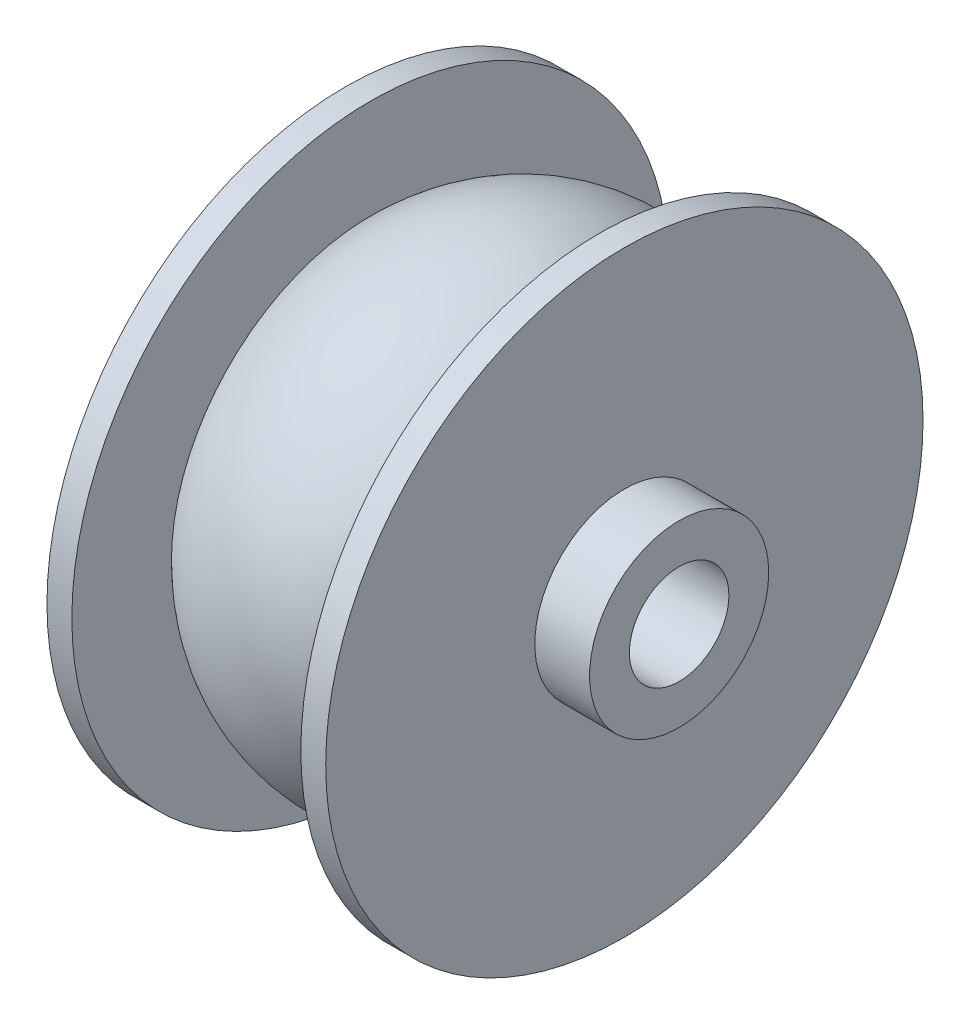
ISO-10303-21;
HEADER;
FILE_DESCRIPTION(('STEP AP214'),'2;1');
FILE_NAME('part.step','',(''),(''),'','','');
FILE_SCHEMA(('AUTOMOTIVE_DESIGN { 1 0 10303 214 1 1 1 1 }'));
ENDSEC;
DATA;
#1=APPLICATION_CONTEXT('core data for automotive mechanical design processes');
#2=APPLICATION_PROTOCOL_DEFINITION('international standard','automotive_design',2000,#1);
#3=PRODUCT_CONTEXT('',#1,'mechanical');
#4=PRODUCT('Part','Part','',(#3));
#5=PRODUCT_RELATED_PRODUCT_CATEGORY('part','',(#4));
#6=PRODUCT_DEFINITION_FORMATION('','',#4);
#7=PRODUCT_DEFINITION_CONTEXT('part definition',#1,'design');
#8=PRODUCT_DEFINITION('design','',#6,#7);
#9=PRODUCT_DEFINITION_SHAPE('','',#8);
#10=(LENGTH_UNIT() NAMED_UNIT(*) SI_UNIT(.MILLI.,.METRE.));
#11=(NAMED_UNIT(*) PLANE_ANGLE_UNIT() SI_UNIT($,.RADIAN.));
#12=(NAMED_UNIT(*) SI_UNIT($,.STERADIAN.) SOLID_ANGLE_UNIT());
#13=UNCERTAINTY_MEASURE_WITH_UNIT(LENGTH_MEASURE(1.E-05),#10,'distance_accuracy_value','');
#14=(GEOMETRIC_REPRESENTATION_CONTEXT(3) GLOBAL_UNCERTAINTY_ASSIGNED_CONTEXT((#13)) GLOBAL_UNIT_ASSIGNED_CONTEXT((#10,
#11,#12)) REPRESENTATION_CONTEXT('',''));
#15=CARTESIAN_POINT('',(0.,0.,0.));
#16=DIRECTION('',(0.,0.,1.));
#17=DIRECTION('',(1.,0.,0.));
#18=AXIS2_PLACEMENT_3D('',#15,#16,#17);
#19=CARTESIAN_POINT('',(5.6,0.,0.));
#20=DIRECTION('',(-1.,0.,0.));
#21=DIRECTION('',(0.,0.,1.));
#22=AXIS2_PLACEMENT_3D('',#19,#20,#21);
#23=CYLINDRICAL_SURFACE('',#22,6.);
#24=CARTESIAN_POINT('',(0.,0.,0.));
#25=DIRECTION('',(1.,0.,0.));
#26=DIRECTION('',(0.,0.,-1.));
#27=AXIS2_PLACEMENT_3D('',#24,#25,#26);
#28=CIRCLE('',#27,6.);
#29=CARTESIAN_POINT('',(0.,0.,-6.));
#30=VERTEX_POINT('',#29);
#31=EDGE_CURVE('E38',#30,#30,#28,.T.);
#32=ORIENTED_EDGE('',*,*,#31,.T.);
#33=EDGE_LOOP('',(#32));
#34=FACE_BOUND('',#33,.T.);
#35=CARTESIAN_POINT('',(0.5,0.,0.));
#36=DIRECTION('',(-1.,0.,0.));
#37=DIRECTION('',(0.,0.,1.));
#38=AXIS2_PLACEMENT_3D('',#35,#36,#37);
#39=CIRCLE('',#38,6.);
#40=CARTESIAN_POINT('',(0.5,0.,6.));
#41=VERTEX_POINT('',#40);
#42=EDGE_CURVE('E62',#41,#41,#39,.T.);
#43=ORIENTED_EDGE('',*,*,#42,.T.);
#44=EDGE_LOOP('',(#43));
#45=FACE_BOUND('',#44,.T.);
#46=ADVANCED_FACE('F31',(#34,#45),#23,.T.);
#47=CARTESIAN_POINT('',(5.6,0.,0.));
#48=DIRECTION('',(1.,0.,0.));
#49=DIRECTION('',(0.,0.,-1.));
#50=AXIS2_PLACEMENT_3D('',#47,#48,#49);
#51=CIRCLE('',#50,6.);
#52=CARTESIAN_POINT('',(5.6,0.,-6.));
#53=VERTEX_POINT('',#52);
#54=EDGE_CURVE('E10',#53,#53,#51,.T.);
#55=ORIENTED_EDGE('',*,*,#54,.F.);
#56=EDGE_LOOP('',(#55));
#57=FACE_BOUND('',#56,.T.);
#58=CARTESIAN_POINT('',(5.1,0.,0.));
#59=DIRECTION('',(-1.,0.,0.));
#60=DIRECTION('',(0.,0.,1.));
#61=AXIS2_PLACEMENT_3D('',#58,#59,#60);
#62=CIRCLE('',#61,6.);
#63=CARTESIAN_POINT('',(5.1,0.,6.));
#64=VERTEX_POINT('',#63);
#65=EDGE_CURVE('E59',#64,#64,#62,.T.);
#66=ORIENTED_EDGE('',*,*,#65,.F.);
#67=EDGE_LOOP('',(#66));
#68=FACE_BOUND('',#67,.T.);
#69=ADVANCED_FACE('F86',(#57,#68),#23,.T.);
#70=CARTESIAN_POINT('',(5.6,0.,0.));
#71=DIRECTION('',(1.,0.,0.));
#72=DIRECTION('',(0.,0.,-1.));
#73=AXIS2_PLACEMENT_3D('',#70,#71,#72);
#74=PLANE('',#73);
#75=ORIENTED_EDGE('',*,*,#54,.T.);
#76=EDGE_LOOP('',(#75));
#77=FACE_BOUND('',#76,.T.);
#78=CARTESIAN_POINT('',(5.6,0.,0.));
#79=DIRECTION('',(1.,0.,0.));
#80=DIRECTION('',(0.,0.,-1.));
#81=AXIS2_PLACEMENT_3D('',#78,#79,#80);
#82=CIRCLE('',#81,1.8);
#83=CARTESIAN_POINT('',(5.6,0.,-1.8));
#84=VERTEX_POINT('',#83);
#85=EDGE_CURVE('E44',#84,#84,#82,.T.);
#86=ORIENTED_EDGE('',*,*,#85,.F.);
#87=EDGE_LOOP('',(#86));
#88=FACE_BOUND('',#87,.T.);
#89=ADVANCED_FACE('F92',(#77,#88),#74,.T.);
#90=CARTESIAN_POINT('',(0.,0.,0.));
#91=DIRECTION('',(1.,0.,0.));
#92=DIRECTION('',(0.,0.,-1.));
#93=AXIS2_PLACEMENT_3D('',#90,#91,#92);
#94=PLANE('',#93);
#95=CARTESIAN_POINT('',(0.,0.,0.));
#96=DIRECTION('',(1.,0.,0.));
#97=DIRECTION('',(0.,0.,-1.));
#98=AXIS2_PLACEMENT_3D('',#95,#96,#97);
#99=CIRCLE('',#98,1.);
#100=CARTESIAN_POINT('',(0.,0.,-1.));
#101=VERTEX_POINT('',#100);
#102=EDGE_CURVE('E34',#101,#101,#99,.T.);
#103=ORIENTED_EDGE('',*,*,#102,.T.);
#104=EDGE_LOOP('',(#103));
#105=FACE_BOUND('',#104,.T.);
#106=ORIENTED_EDGE('',*,*,#31,.F.);
#107=EDGE_LOOP('',(#106));
#108=FACE_BOUND('',#107,.T.);
#109=ADVANCED_FACE('F96',(#105,#108),#94,.F.);
#110=CARTESIAN_POINT('',(-1.1,0.,0.));
#111=DIRECTION('',(1.,0.,0.));
#112=DIRECTION('',(0.,0.,-1.));
#113=AXIS2_PLACEMENT_3D('',#110,#111,#112);
#114=CYLINDRICAL_SURFACE('',#113,1.);
#115=ORIENTED_EDGE('',*,*,#102,.F.);
#116=EDGE_LOOP('',(#115));
#117=FACE_BOUND('',#116,.T.);
#118=CARTESIAN_POINT('',(6.7,0.,0.));
#119=DIRECTION('',(1.,0.,0.));
#120=DIRECTION('',(0.,0.,-1.));
#121=AXIS2_PLACEMENT_3D('',#118,#119,#120);
#122=CIRCLE('',#121,1.);
#123=CARTESIAN_POINT('',(6.7,0.,-1.));
#124=VERTEX_POINT('',#123);
#125=EDGE_CURVE('E48',#124,#124,#122,.T.);
#126=ORIENTED_EDGE('',*,*,#125,.T.);
#127=EDGE_LOOP('',(#126));
#128=FACE_BOUND('',#127,.T.);
#129=ADVANCED_FACE('F98',(#117,#128),#114,.F.);
#130=CARTESIAN_POINT('',(6.7,0.,0.));
#131=DIRECTION('',(1.,0.,0.));
#132=DIRECTION('',(0.,0.,-1.));
#133=AXIS2_PLACEMENT_3D('',#130,#131,#132);
#134=PLANE('',#133);
#135=CARTESIAN_POINT('',(6.7,0.,0.));
#136=DIRECTION('',(1.,0.,0.));
#137=DIRECTION('',(0.,0.,-1.));
#138=AXIS2_PLACEMENT_3D('',#135,#136,#137);
#139=CIRCLE('',#138,1.8);
#140=CARTESIAN_POINT('',(6.7,0.,-1.8));
#141=VERTEX_POINT('',#140);
#142=EDGE_CURVE('E47',#141,#141,#139,.T.);
#143=ORIENTED_EDGE('',*,*,#142,.T.);
#144=EDGE_LOOP('',(#143));
#145=FACE_BOUND('',#144,.T.);
#146=ORIENTED_EDGE('',*,*,#125,.F.);
#147=EDGE_LOOP('',(#146));
#148=FACE_BOUND('',#147,.T.);
#149=ADVANCED_FACE('F81',(#145,#148),#134,.T.);
#150=CARTESIAN_POINT('',(6.7,0.,0.));
#151=DIRECTION('',(-1.,0.,0.));
#152=DIRECTION('',(0.,0.,1.));
#153=AXIS2_PLACEMENT_3D('',#150,#151,#152);
#154=CYLINDRICAL_SURFACE('',#153,1.8);
#155=ORIENTED_EDGE('',*,*,#142,.F.);
#156=EDGE_LOOP('',(#155));
#157=FACE_BOUND('',#156,.T.);
#158=ORIENTED_EDGE('',*,*,#85,.T.);
#159=EDGE_LOOP('',(#158));
#160=FACE_BOUND('',#159,.T.);
#161=ADVANCED_FACE('F70',(#157,#160),#154,.T.);
#162=CARTESIAN_POINT('',(0.5,0.,0.));
#163=DIRECTION('',(1.,0.,0.));
#164=DIRECTION('',(0.,0.,-1.));
#165=AXIS2_PLACEMENT_3D('',#162,#163,#164);
#166=PLANE('',#165);
#167=CARTESIAN_POINT('',(0.5,0.,0.));
#168=DIRECTION('',(-1.,0.,0.));
#169=DIRECTION('',(0.,0.,1.));
#170=AXIS2_PLACEMENT_3D('',#167,#168,#169);
#171=CIRCLE('',#170,4.);
#172=CARTESIAN_POINT('',(0.5,0.,4.));
#173=VERTEX_POINT('',#172);
#174=EDGE_CURVE('E53',#173,#173,#171,.T.);
#175=ORIENTED_EDGE('',*,*,#174,.T.);
#176=EDGE_LOOP('',(#175));
#177=FACE_BOUND('',#176,.T.);
#178=ORIENTED_EDGE('',*,*,#42,.F.);
#179=EDGE_LOOP('',(#178));
#180=FACE_BOUND('',#179,.T.);
#181=ADVANCED_FACE('F67',(#177,#180),#166,.T.);
#182=CARTESIAN_POINT('',(2.8,0.,0.));
#183=DIRECTION('',(-1.,0.,0.));
#184=DIRECTION('',(0.,0.,1.));
#185=AXIS2_PLACEMENT_3D('',#182,#183,#184);
#186=DEGENERATE_TOROIDAL_SURFACE('',#185,1.7,3.25269119345812,.T.);
#187=CARTESIAN_POINT('',(5.1,0.,0.));
#188=DIRECTION('',(-1.,0.,0.));
#189=DIRECTION('',(0.,0.,1.));
#190=AXIS2_PLACEMENT_3D('',#187,#188,#189);
#191=CIRCLE('',#190,4.);
#192=CARTESIAN_POINT('',(5.1,0.,4.));
#193=VERTEX_POINT('',#192);
#194=EDGE_CURVE('E56',#193,#193,#191,.T.);
#195=ORIENTED_EDGE('',*,*,#194,.T.);
#196=EDGE_LOOP('',(#195));
#197=FACE_BOUND('',#196,.T.);
#198=ORIENTED_EDGE('',*,*,#174,.F.);
#199=EDGE_LOOP('',(#198));
#200=FACE_BOUND('',#199,.T.);
#201=ADVANCED_FACE('F69',(#197,#200),#186,.T.);
#202=CARTESIAN_POINT('',(5.1,0.,0.));
#203=DIRECTION('',(-1.,0.,0.));
#204=DIRECTION('',(0.,0.,1.));
#205=AXIS2_PLACEMENT_3D('',#202,#203,#204);
#206=PLANE('',#205);
#207=ORIENTED_EDGE('',*,*,#65,.T.);
#208=EDGE_LOOP('',(#207));
#209=FACE_BOUND('',#208,.T.);
#210=ORIENTED_EDGE('',*,*,#194,.F.);
#211=EDGE_LOOP('',(#210));
#212=FACE_BOUND('',#211,.T.);
#213=ADVANCED_FACE('F77',(#209,#212),#206,.T.);
#214=CLOSED_SHELL('',(#46,#69,#89,#109,#129,#149,#161,#181,#201,#213));
#215=MANIFOLD_SOLID_BREP('B2',#214);
#216=ADVANCED_BREP_SHAPE_REPRESENTATION('',(#18,#215),#14);
#217=SHAPE_DEFINITION_REPRESENTATION(#9,#216);
ENDSEC;
END-ISO-10303-21;
